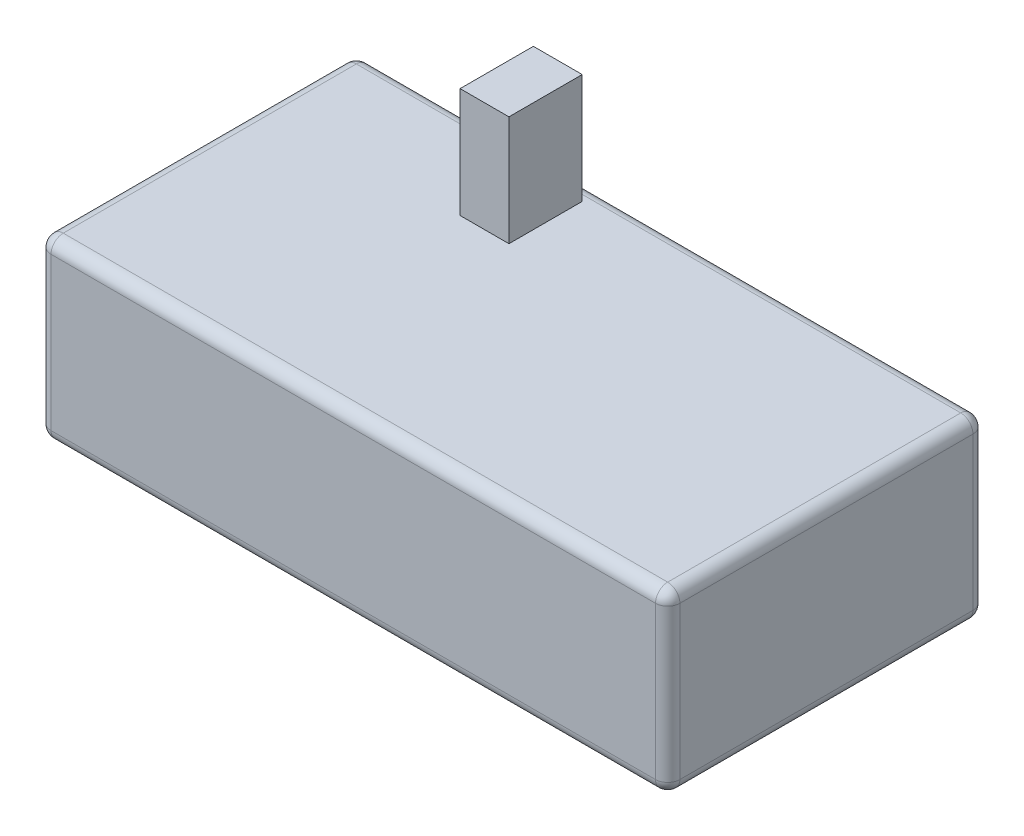
ISO-10303-21;
HEADER;
FILE_DESCRIPTION(('STEP AP214'),'2;1');
FILE_NAME('part.step','',(''),(''),'','','');
FILE_SCHEMA(('AUTOMOTIVE_DESIGN { 1 0 10303 214 1 1 1 1 }'));
ENDSEC;
DATA;
#1=APPLICATION_CONTEXT('core data for automotive mechanical design processes');
#2=APPLICATION_PROTOCOL_DEFINITION('international standard','automotive_design',2000,#1);
#3=PRODUCT_CONTEXT('',#1,'mechanical');
#4=PRODUCT('Part','Part','',(#3));
#5=PRODUCT_RELATED_PRODUCT_CATEGORY('part','',(#4));
#6=PRODUCT_DEFINITION_FORMATION('','',#4);
#7=PRODUCT_DEFINITION_CONTEXT('part definition',#1,'design');
#8=PRODUCT_DEFINITION('design','',#6,#7);
#9=PRODUCT_DEFINITION_SHAPE('','',#8);
#10=(LENGTH_UNIT() NAMED_UNIT(*) SI_UNIT(.MILLI.,.METRE.));
#11=(NAMED_UNIT(*) PLANE_ANGLE_UNIT() SI_UNIT($,.RADIAN.));
#12=(NAMED_UNIT(*) SI_UNIT($,.STERADIAN.) SOLID_ANGLE_UNIT());
#13=UNCERTAINTY_MEASURE_WITH_UNIT(LENGTH_MEASURE(1.E-05),#10,'distance_accuracy_value','');
#14=(GEOMETRIC_REPRESENTATION_CONTEXT(3) GLOBAL_UNCERTAINTY_ASSIGNED_CONTEXT((#13)) GLOBAL_UNIT_ASSIGNED_CONTEXT((#10,
#11,#12)) REPRESENTATION_CONTEXT('',''));
#15=CARTESIAN_POINT('',(0.,0.,0.));
#16=DIRECTION('',(0.,0.,1.));
#17=DIRECTION('',(1.,0.,0.));
#18=AXIS2_PLACEMENT_3D('',#15,#16,#17);
#19=CARTESIAN_POINT('',(-65.405,36.83,-33.02));
#20=DIRECTION('',(0.,0.,1.));
#21=DIRECTION('',(1.,0.,0.));
#22=AXIS2_PLACEMENT_3D('',#19,#20,#21);
#23=PLANE('',#22);
#24=DIRECTION('',(0.,-1.,0.));
#25=VECTOR('',#24,1.);
#26=CARTESIAN_POINT('',(62.865,36.83,-33.02));
#27=LINE('',#26,#25);
#28=CARTESIAN_POINT('',(62.865,34.29,-33.02));
#29=VERTEX_POINT('',#28);
#30=CARTESIAN_POINT('',(62.865,2.54,-33.02));
#31=VERTEX_POINT('',#30);
#32=EDGE_CURVE('E298',#29,#31,#27,.T.);
#33=ORIENTED_EDGE('',*,*,#32,.T.);
#34=DIRECTION('',(-1.,0.,0.));
#35=VECTOR('',#34,1.);
#36=CARTESIAN_POINT('',(-65.405,2.54,-33.02));
#37=LINE('',#36,#35);
#38=CARTESIAN_POINT('',(-62.865,2.54,-33.02));
#39=VERTEX_POINT('',#38);
#40=EDGE_CURVE('E302',#31,#39,#37,.T.);
#41=ORIENTED_EDGE('',*,*,#40,.T.);
#42=DIRECTION('',(0.,-1.,0.));
#43=VECTOR('',#42,1.);
#44=CARTESIAN_POINT('',(-62.865,36.83,-33.02));
#45=LINE('',#44,#43);
#46=CARTESIAN_POINT('',(-62.865,34.29,-33.02));
#47=VERTEX_POINT('',#46);
#48=EDGE_CURVE('E300',#39,#47,#45,.F.);
#49=ORIENTED_EDGE('',*,*,#48,.T.);
#50=DIRECTION('',(-1.,0.,0.));
#51=VECTOR('',#50,1.);
#52=CARTESIAN_POINT('',(65.405,34.29,-33.02));
#53=LINE('',#52,#51);
#54=EDGE_CURVE('E296',#47,#29,#53,.F.);
#55=ORIENTED_EDGE('',*,*,#54,.T.);
#56=EDGE_LOOP('',(#33,#41,#49,#55));
#57=FACE_BOUND('',#56,.T.);
#58=DIRECTION('',(0.,-1.,0.));
#59=VECTOR('',#58,1.);
#60=CARTESIAN_POINT('',(0.594999999999971,12.,-33.02));
#61=LINE('',#60,#59);
#62=CARTESIAN_POINT('',(0.594999999999971,12.,-33.02));
#63=VERTEX_POINT('',#62);
#64=CARTESIAN_POINT('',(0.594999999999971,7.936,-33.02));
#65=VERTEX_POINT('',#64);
#66=EDGE_CURVE('E233',#63,#65,#61,.T.);
#67=ORIENTED_EDGE('',*,*,#66,.F.);
#68=DIRECTION('',(1.,0.,0.));
#69=VECTOR('',#68,1.);
#70=CARTESIAN_POINT('',(0.594999999999971,12.,-33.02));
#71=LINE('',#70,#69);
#72=CARTESIAN_POINT('',(-12.405,12.,-33.02));
#73=VERTEX_POINT('',#72);
#74=EDGE_CURVE('E238',#73,#63,#71,.T.);
#75=ORIENTED_EDGE('',*,*,#74,.F.);
#76=DIRECTION('',(0.,1.,0.));
#77=VECTOR('',#76,1.);
#78=CARTESIAN_POINT('',(-12.405,12.,-33.02));
#79=LINE('',#78,#77);
#80=CARTESIAN_POINT('',(-12.405,7.936,-33.02));
#81=VERTEX_POINT('',#80);
#82=EDGE_CURVE('E250',#81,#73,#79,.T.);
#83=ORIENTED_EDGE('',*,*,#82,.F.);
#84=DIRECTION('',(-1.,0.,0.));
#85=VECTOR('',#84,1.);
#86=CARTESIAN_POINT('',(0.59499999999997,7.936,-33.02));
#87=LINE('',#86,#85);
#88=EDGE_CURVE('E247',#65,#81,#87,.T.);
#89=ORIENTED_EDGE('',*,*,#88,.F.);
#90=EDGE_LOOP('',(#67,#75,#83,#89));
#91=FACE_BOUND('',#90,.T.);
#92=ADVANCED_FACE('F33',(#57,#91),#23,.F.);
#93=CARTESIAN_POINT('',(0.,36.83,0.));
#94=DIRECTION('',(0.,1.,0.));
#95=DIRECTION('',(0.,0.,1.));
#96=AXIS2_PLACEMENT_3D('',#93,#94,#95);
#97=PLANE('',#96);
#98=DIRECTION('',(0.,0.,-1.));
#99=VECTOR('',#98,1.);
#100=CARTESIAN_POINT('',(62.865,36.83,-33.02));
#101=LINE('',#100,#99);
#102=CARTESIAN_POINT('',(62.865,36.83,30.48));
#103=VERTEX_POINT('',#102);
#104=CARTESIAN_POINT('',(62.865,36.83,-30.48));
#105=VERTEX_POINT('',#104);
#106=EDGE_CURVE('E42',#103,#105,#101,.T.);
#107=ORIENTED_EDGE('',*,*,#106,.T.);
#108=DIRECTION('',(-1.,0.,0.));
#109=VECTOR('',#108,1.);
#110=CARTESIAN_POINT('',(-65.405,36.83,-30.48));
#111=LINE('',#110,#109);
#112=CARTESIAN_POINT('',(-62.865,36.83,-30.48));
#113=VERTEX_POINT('',#112);
#114=EDGE_CURVE('E11',#105,#113,#111,.T.);
#115=ORIENTED_EDGE('',*,*,#114,.T.);
#116=DIRECTION('',(0.,0.,1.));
#117=VECTOR('',#116,1.);
#118=CARTESIAN_POINT('',(-62.865,36.83,33.02));
#119=LINE('',#118,#117);
#120=CARTESIAN_POINT('',(-62.865,36.83,30.48));
#121=VERTEX_POINT('',#120);
#122=EDGE_CURVE('E341',#113,#121,#119,.T.);
#123=ORIENTED_EDGE('',*,*,#122,.T.);
#124=DIRECTION('',(1.,0.,0.));
#125=VECTOR('',#124,1.);
#126=CARTESIAN_POINT('',(65.405,36.83,30.48));
#127=LINE('',#126,#125);
#128=EDGE_CURVE('E343',#121,#103,#127,.T.);
#129=ORIENTED_EDGE('',*,*,#128,.T.);
#130=EDGE_LOOP('',(#107,#115,#123,#129));
#131=FACE_BOUND('',#130,.T.);
#132=DIRECTION('',(-1.,0.,0.));
#133=VECTOR('',#132,1.);
#134=CARTESIAN_POINT('',(-14.605,36.83,-29.21));
#135=LINE('',#134,#133);
#136=CARTESIAN_POINT('',(-14.605,36.83,-29.21));
#137=VERTEX_POINT('',#136);
#138=CARTESIAN_POINT('',(-24.765,36.83,-29.21));
#139=VERTEX_POINT('',#138);
#140=EDGE_CURVE('E280',#137,#139,#135,.T.);
#141=ORIENTED_EDGE('',*,*,#140,.F.);
#142=DIRECTION('',(0.,0.,-1.));
#143=VECTOR('',#142,1.);
#144=CARTESIAN_POINT('',(-14.605,36.83,-13.97));
#145=LINE('',#144,#143);
#146=CARTESIAN_POINT('',(-14.605,36.83,-13.97));
#147=VERTEX_POINT('',#146);
#148=EDGE_CURVE('E266',#147,#137,#145,.T.);
#149=ORIENTED_EDGE('',*,*,#148,.F.);
#150=DIRECTION('',(1.,0.,0.));
#151=VECTOR('',#150,1.);
#152=CARTESIAN_POINT('',(-14.605,36.83,-13.97));
#153=LINE('',#152,#151);
#154=CARTESIAN_POINT('',(-24.765,36.83,-13.97));
#155=VERTEX_POINT('',#154);
#156=EDGE_CURVE('E271',#155,#147,#153,.T.);
#157=ORIENTED_EDGE('',*,*,#156,.F.);
#158=DIRECTION('',(0.,0.,1.));
#159=VECTOR('',#158,1.);
#160=CARTESIAN_POINT('',(-24.765,36.83,-13.97));
#161=LINE('',#160,#159);
#162=EDGE_CURVE('E282',#139,#155,#161,.T.);
#163=ORIENTED_EDGE('',*,*,#162,.F.);
#164=EDGE_LOOP('',(#141,#149,#157,#163));
#165=FACE_BOUND('',#164,.T.);
#166=ADVANCED_FACE('F436',(#131,#165),#97,.T.);
#167=CARTESIAN_POINT('',(-65.405,36.83,-33.02));
#168=DIRECTION('',(1.,0.,0.));
#169=DIRECTION('',(0.,0.,-1.));
#170=AXIS2_PLACEMENT_3D('',#167,#168,#169);
#171=PLANE('',#170);
#172=DIRECTION('',(0.,0.,1.));
#173=VECTOR('',#172,1.);
#174=CARTESIAN_POINT('',(-65.405,34.29,-33.02));
#175=LINE('',#174,#173);
#176=CARTESIAN_POINT('',(-65.405,34.29,30.48));
#177=VERTEX_POINT('',#176);
#178=CARTESIAN_POINT('',(-65.405,34.29,-30.48));
#179=VERTEX_POINT('',#178);
#180=EDGE_CURVE('E314',#177,#179,#175,.F.);
#181=ORIENTED_EDGE('',*,*,#180,.T.);
#182=DIRECTION('',(0.,-1.,0.));
#183=VECTOR('',#182,1.);
#184=CARTESIAN_POINT('',(-65.405,36.83,-30.48));
#185=LINE('',#184,#183);
#186=CARTESIAN_POINT('',(-65.405,2.54,-30.48));
#187=VERTEX_POINT('',#186);
#188=EDGE_CURVE('E320',#179,#187,#185,.T.);
#189=ORIENTED_EDGE('',*,*,#188,.T.);
#190=DIRECTION('',(0.,0.,1.));
#191=VECTOR('',#190,1.);
#192=CARTESIAN_POINT('',(-65.405,2.54,-33.02));
#193=LINE('',#192,#191);
#194=CARTESIAN_POINT('',(-65.405,2.54,30.48));
#195=VERTEX_POINT('',#194);
#196=EDGE_CURVE('E318',#187,#195,#193,.T.);
#197=ORIENTED_EDGE('',*,*,#196,.T.);
#198=DIRECTION('',(0.,-1.,0.));
#199=VECTOR('',#198,1.);
#200=CARTESIAN_POINT('',(-65.405,36.83,30.48));
#201=LINE('',#200,#199);
#202=EDGE_CURVE('E316',#195,#177,#201,.F.);
#203=ORIENTED_EDGE('',*,*,#202,.T.);
#204=EDGE_LOOP('',(#181,#189,#197,#203));
#205=FACE_BOUND('',#204,.T.);
#206=ADVANCED_FACE('F498',(#205),#171,.F.);
#207=CARTESIAN_POINT('',(-65.405,36.83,33.02));
#208=DIRECTION('',(0.,0.,-1.));
#209=DIRECTION('',(-1.,0.,0.));
#210=AXIS2_PLACEMENT_3D('',#207,#208,#209);
#211=PLANE('',#210);
#212=DIRECTION('',(1.,0.,0.));
#213=VECTOR('',#212,1.);
#214=CARTESIAN_POINT('',(-65.405,34.29,33.02));
#215=LINE('',#214,#213);
#216=CARTESIAN_POINT('',(62.865,34.29,33.02));
#217=VERTEX_POINT('',#216);
#218=CARTESIAN_POINT('',(-62.865,34.29,33.02));
#219=VERTEX_POINT('',#218);
#220=EDGE_CURVE('E323',#217,#219,#215,.F.);
#221=ORIENTED_EDGE('',*,*,#220,.T.);
#222=DIRECTION('',(0.,-1.,0.));
#223=VECTOR('',#222,1.);
#224=CARTESIAN_POINT('',(-62.865,36.83,33.02));
#225=LINE('',#224,#223);
#226=CARTESIAN_POINT('',(-62.865,2.54,33.02));
#227=VERTEX_POINT('',#226);
#228=EDGE_CURVE('E329',#219,#227,#225,.T.);
#229=ORIENTED_EDGE('',*,*,#228,.T.);
#230=DIRECTION('',(1.,0.,0.));
#231=VECTOR('',#230,1.);
#232=CARTESIAN_POINT('',(-65.405,2.54,33.02));
#233=LINE('',#232,#231);
#234=CARTESIAN_POINT('',(62.865,2.54,33.02));
#235=VERTEX_POINT('',#234);
#236=EDGE_CURVE('E327',#227,#235,#233,.T.);
#237=ORIENTED_EDGE('',*,*,#236,.T.);
#238=DIRECTION('',(0.,-1.,0.));
#239=VECTOR('',#238,1.);
#240=CARTESIAN_POINT('',(62.865,36.83,33.02));
#241=LINE('',#240,#239);
#242=EDGE_CURVE('E325',#235,#217,#241,.F.);
#243=ORIENTED_EDGE('',*,*,#242,.T.);
#244=EDGE_LOOP('',(#221,#229,#237,#243));
#245=FACE_BOUND('',#244,.T.);
#246=ADVANCED_FACE('F459',(#245),#211,.F.);
#247=CARTESIAN_POINT('',(65.405,36.83,-33.02));
#248=DIRECTION('',(-1.,0.,0.));
#249=DIRECTION('',(0.,0.,1.));
#250=AXIS2_PLACEMENT_3D('',#247,#248,#249);
#251=PLANE('',#250);
#252=DIRECTION('',(0.,-1.,0.));
#253=VECTOR('',#252,1.);
#254=CARTESIAN_POINT('',(65.405,36.83,30.48));
#255=LINE('',#254,#253);
#256=CARTESIAN_POINT('',(65.405,34.29,30.48));
#257=VERTEX_POINT('',#256);
#258=CARTESIAN_POINT('',(65.405,2.54,30.48));
#259=VERTEX_POINT('',#258);
#260=EDGE_CURVE('E336',#257,#259,#255,.T.);
#261=ORIENTED_EDGE('',*,*,#260,.T.);
#262=DIRECTION('',(0.,0.,-1.));
#263=VECTOR('',#262,1.);
#264=CARTESIAN_POINT('',(65.405,2.54,-33.02));
#265=LINE('',#264,#263);
#266=CARTESIAN_POINT('',(65.405,2.54,-30.48));
#267=VERTEX_POINT('',#266);
#268=EDGE_CURVE('E339',#259,#267,#265,.T.);
#269=ORIENTED_EDGE('',*,*,#268,.T.);
#270=DIRECTION('',(0.,-1.,0.));
#271=VECTOR('',#270,1.);
#272=CARTESIAN_POINT('',(65.405,36.83,-30.48));
#273=LINE('',#272,#271);
#274=CARTESIAN_POINT('',(65.405,34.29,-30.48));
#275=VERTEX_POINT('',#274);
#276=EDGE_CURVE('E334',#267,#275,#273,.F.);
#277=ORIENTED_EDGE('',*,*,#276,.T.);
#278=DIRECTION('',(0.,0.,-1.));
#279=VECTOR('',#278,1.);
#280=CARTESIAN_POINT('',(65.405,34.29,33.02));
#281=LINE('',#280,#279);
#282=EDGE_CURVE('E332',#275,#257,#281,.F.);
#283=ORIENTED_EDGE('',*,*,#282,.T.);
#284=EDGE_LOOP('',(#261,#269,#277,#283));
#285=FACE_BOUND('',#284,.T.);
#286=ADVANCED_FACE('F428',(#285),#251,.F.);
#287=CARTESIAN_POINT('',(0.,0.,0.));
#288=DIRECTION('',(0.,1.,0.));
#289=DIRECTION('',(0.,0.,1.));
#290=AXIS2_PLACEMENT_3D('',#287,#288,#289);
#291=PLANE('',#290);
#292=DIRECTION('',(0.,0.,1.));
#293=VECTOR('',#292,1.);
#294=CARTESIAN_POINT('',(-62.865,0.,0.));
#295=LINE('',#294,#293);
#296=CARTESIAN_POINT('',(-62.865,0.,30.48));
#297=VERTEX_POINT('',#296);
#298=CARTESIAN_POINT('',(-62.865,0.,-30.48));
#299=VERTEX_POINT('',#298);
#300=EDGE_CURVE('E309',#297,#299,#295,.F.);
#301=ORIENTED_EDGE('',*,*,#300,.T.);
#302=DIRECTION('',(-1.,0.,0.));
#303=VECTOR('',#302,1.);
#304=CARTESIAN_POINT('',(0.,0.,-30.48));
#305=LINE('',#304,#303);
#306=CARTESIAN_POINT('',(62.865,0.,-30.48));
#307=VERTEX_POINT('',#306);
#308=EDGE_CURVE('E311',#299,#307,#305,.F.);
#309=ORIENTED_EDGE('',*,*,#308,.T.);
#310=DIRECTION('',(0.,0.,-1.));
#311=VECTOR('',#310,1.);
#312=CARTESIAN_POINT('',(62.865,0.,0.));
#313=LINE('',#312,#311);
#314=CARTESIAN_POINT('',(62.865,0.,30.48));
#315=VERTEX_POINT('',#314);
#316=EDGE_CURVE('E305',#307,#315,#313,.F.);
#317=ORIENTED_EDGE('',*,*,#316,.T.);
#318=DIRECTION('',(1.,0.,0.));
#319=VECTOR('',#318,1.);
#320=CARTESIAN_POINT('',(0.,0.,30.48));
#321=LINE('',#320,#319);
#322=EDGE_CURVE('E307',#315,#297,#321,.F.);
#323=ORIENTED_EDGE('',*,*,#322,.T.);
#324=EDGE_LOOP('',(#301,#309,#317,#323));
#325=FACE_BOUND('',#324,.T.);
#326=ADVANCED_FACE('F503',(#325),#291,.F.);
#327=CARTESIAN_POINT('',(0.,34.29,30.48));
#328=DIRECTION('',(-1.,0.,0.));
#329=DIRECTION('',(0.,0.,1.));
#330=AXIS2_PLACEMENT_3D('',#327,#328,#329);
#331=CYLINDRICAL_SURFACE('',#330,2.54);
#332=CARTESIAN_POINT('',(62.865,34.29,30.48));
#333=DIRECTION('',(1.,0.,0.));
#334=DIRECTION('',(0.,0.,-1.));
#335=AXIS2_PLACEMENT_3D('',#332,#333,#334);
#336=CIRCLE('',#335,2.54);
#337=EDGE_CURVE('E37',#103,#217,#336,.T.);
#338=ORIENTED_EDGE('',*,*,#337,.F.);
#339=ORIENTED_EDGE('',*,*,#128,.F.);
#340=CARTESIAN_POINT('',(-62.865,34.29,30.48));
#341=DIRECTION('',(-1.,0.,0.));
#342=DIRECTION('',(0.,-1.,0.));
#343=AXIS2_PLACEMENT_3D('',#340,#341,#342);
#344=CIRCLE('',#343,2.54);
#345=EDGE_CURVE('E405',#219,#121,#344,.T.);
#346=ORIENTED_EDGE('',*,*,#345,.F.);
#347=ORIENTED_EDGE('',*,*,#220,.F.);
#348=EDGE_LOOP('',(#338,#339,#346,#347));
#349=FACE_BOUND('',#348,.T.);
#350=ADVANCED_FACE('F35',(#349),#331,.T.);
#351=CARTESIAN_POINT('',(62.865,34.29,30.48));
#352=DIRECTION('',(0.,0.,1.));
#353=DIRECTION('',(1.,0.,0.));
#354=AXIS2_PLACEMENT_3D('',#351,#352,#353);
#355=SPHERICAL_SURFACE('',#354,2.54);
#356=CARTESIAN_POINT('',(62.865,34.29,30.48));
#357=DIRECTION('',(0.,0.,1.));
#358=DIRECTION('',(1.,0.,0.));
#359=AXIS2_PLACEMENT_3D('',#356,#357,#358);
#360=CIRCLE('',#359,2.54);
#361=EDGE_CURVE('E400',#103,#257,#360,.F.);
#362=ORIENTED_EDGE('',*,*,#361,.F.);
#363=ORIENTED_EDGE('',*,*,#337,.T.);
#364=CARTESIAN_POINT('',(62.865,34.29,30.48));
#365=DIRECTION('',(0.,1.,0.));
#366=DIRECTION('',(0.,0.,1.));
#367=AXIS2_PLACEMENT_3D('',#364,#365,#366);
#368=CIRCLE('',#367,2.54);
#369=EDGE_CURVE('E403',#257,#217,#368,.F.);
#370=ORIENTED_EDGE('',*,*,#369,.F.);
#371=EDGE_LOOP('',(#362,#363,#370));
#372=FACE_BOUND('',#371,.T.);
#373=ADVANCED_FACE('F416',(#372),#355,.T.);
#374=CARTESIAN_POINT('',(-62.865,34.29,30.48));
#375=DIRECTION('',(0.,0.,1.));
#376=DIRECTION('',(1.,0.,0.));
#377=AXIS2_PLACEMENT_3D('',#374,#375,#376);
#378=SPHERICAL_SURFACE('',#377,2.54);
#379=CARTESIAN_POINT('',(-62.865,34.29,30.48));
#380=DIRECTION('',(0.,1.,0.));
#381=DIRECTION('',(0.,0.,1.));
#382=AXIS2_PLACEMENT_3D('',#379,#380,#381);
#383=CIRCLE('',#382,2.54);
#384=EDGE_CURVE('E394',#219,#177,#383,.F.);
#385=ORIENTED_EDGE('',*,*,#384,.F.);
#386=ORIENTED_EDGE('',*,*,#345,.T.);
#387=CARTESIAN_POINT('',(-62.865,34.29,30.48));
#388=DIRECTION('',(0.,0.,1.));
#389=DIRECTION('',(1.,0.,0.));
#390=AXIS2_PLACEMENT_3D('',#387,#388,#389);
#391=CIRCLE('',#390,2.54);
#392=EDGE_CURVE('E397',#177,#121,#391,.F.);
#393=ORIENTED_EDGE('',*,*,#392,.F.);
#394=EDGE_LOOP('',(#385,#386,#393));
#395=FACE_BOUND('',#394,.T.);
#396=ADVANCED_FACE('F452',(#395),#378,.T.);
#397=CARTESIAN_POINT('',(62.865,36.83,30.48));
#398=DIRECTION('',(0.,-1.,0.));
#399=DIRECTION('',(0.,0.,-1.));
#400=AXIS2_PLACEMENT_3D('',#397,#398,#399);
#401=CYLINDRICAL_SURFACE('',#400,2.54);
#402=ORIENTED_EDGE('',*,*,#369,.T.);
#403=ORIENTED_EDGE('',*,*,#242,.F.);
#404=CARTESIAN_POINT('',(62.865,2.54,30.48));
#405=DIRECTION('',(0.,-1.,0.));
#406=DIRECTION('',(0.,0.,-1.));
#407=AXIS2_PLACEMENT_3D('',#404,#405,#406);
#408=CIRCLE('',#407,2.54);
#409=EDGE_CURVE('E388',#259,#235,#408,.T.);
#410=ORIENTED_EDGE('',*,*,#409,.F.);
#411=ORIENTED_EDGE('',*,*,#260,.F.);
#412=EDGE_LOOP('',(#402,#403,#410,#411));
#413=FACE_BOUND('',#412,.T.);
#414=ADVANCED_FACE('F424',(#413),#401,.T.);
#415=CARTESIAN_POINT('',(62.865,34.29,0.));
#416=DIRECTION('',(0.,0.,1.));
#417=DIRECTION('',(1.,0.,0.));
#418=AXIS2_PLACEMENT_3D('',#415,#416,#417);
#419=CYLINDRICAL_SURFACE('',#418,2.54);
#420=ORIENTED_EDGE('',*,*,#361,.T.);
#421=ORIENTED_EDGE('',*,*,#282,.F.);
#422=CARTESIAN_POINT('',(62.865,34.29,-30.48));
#423=DIRECTION('',(0.,0.,-1.));
#424=DIRECTION('',(-1.,0.,0.));
#425=AXIS2_PLACEMENT_3D('',#422,#423,#424);
#426=CIRCLE('',#425,2.54);
#427=EDGE_CURVE('E385',#105,#275,#426,.T.);
#428=ORIENTED_EDGE('',*,*,#427,.F.);
#429=ORIENTED_EDGE('',*,*,#106,.F.);
#430=EDGE_LOOP('',(#420,#421,#428,#429));
#431=FACE_BOUND('',#430,.T.);
#432=ADVANCED_FACE('F433',(#431),#419,.T.);
#433=CARTESIAN_POINT('',(0.,34.29,-30.48));
#434=DIRECTION('',(1.,0.,0.));
#435=DIRECTION('',(0.,0.,-1.));
#436=AXIS2_PLACEMENT_3D('',#433,#434,#435);
#437=CYLINDRICAL_SURFACE('',#436,2.54);
#438=CARTESIAN_POINT('',(-62.865,34.29,-30.48));
#439=DIRECTION('',(-1.,0.,0.));
#440=DIRECTION('',(0.,0.,1.));
#441=AXIS2_PLACEMENT_3D('',#438,#439,#440);
#442=CIRCLE('',#441,2.54);
#443=EDGE_CURVE('E379',#113,#47,#442,.T.);
#444=ORIENTED_EDGE('',*,*,#443,.F.);
#445=ORIENTED_EDGE('',*,*,#114,.F.);
#446=CARTESIAN_POINT('',(62.865,34.29,-30.48));
#447=DIRECTION('',(1.,0.,0.));
#448=DIRECTION('',(0.,1.,0.));
#449=AXIS2_PLACEMENT_3D('',#446,#447,#448);
#450=CIRCLE('',#449,2.54);
#451=EDGE_CURVE('E382',#29,#105,#450,.T.);
#452=ORIENTED_EDGE('',*,*,#451,.F.);
#453=ORIENTED_EDGE('',*,*,#54,.F.);
#454=EDGE_LOOP('',(#444,#445,#452,#453));
#455=FACE_BOUND('',#454,.T.);
#456=ADVANCED_FACE('F441',(#455),#437,.T.);
#457=CARTESIAN_POINT('',(-62.865,34.29,0.));
#458=DIRECTION('',(0.,0.,-1.));
#459=DIRECTION('',(-1.,0.,0.));
#460=AXIS2_PLACEMENT_3D('',#457,#458,#459);
#461=CYLINDRICAL_SURFACE('',#460,2.54);
#462=ORIENTED_EDGE('',*,*,#392,.T.);
#463=ORIENTED_EDGE('',*,*,#122,.F.);
#464=CARTESIAN_POINT('',(-62.865,34.29,-30.48));
#465=DIRECTION('',(0.,0.,-1.));
#466=DIRECTION('',(-1.,0.,0.));
#467=AXIS2_PLACEMENT_3D('',#464,#465,#466);
#468=CIRCLE('',#467,2.54);
#469=EDGE_CURVE('E377',#179,#113,#468,.T.);
#470=ORIENTED_EDGE('',*,*,#469,.F.);
#471=ORIENTED_EDGE('',*,*,#180,.F.);
#472=EDGE_LOOP('',(#462,#463,#470,#471));
#473=FACE_BOUND('',#472,.T.);
#474=ADVANCED_FACE('F449',(#473),#461,.T.);
#475=CARTESIAN_POINT('',(-62.865,36.83,30.48));
#476=DIRECTION('',(0.,-1.,0.));
#477=DIRECTION('',(0.,0.,-1.));
#478=AXIS2_PLACEMENT_3D('',#475,#476,#477);
#479=CYLINDRICAL_SURFACE('',#478,2.54);
#480=ORIENTED_EDGE('',*,*,#384,.T.);
#481=ORIENTED_EDGE('',*,*,#202,.F.);
#482=CARTESIAN_POINT('',(-62.865,2.54,30.48));
#483=DIRECTION('',(0.,-1.,0.));
#484=DIRECTION('',(0.,0.,-1.));
#485=AXIS2_PLACEMENT_3D('',#482,#483,#484);
#486=CIRCLE('',#485,2.54);
#487=EDGE_CURVE('E374',#227,#195,#486,.T.);
#488=ORIENTED_EDGE('',*,*,#487,.F.);
#489=ORIENTED_EDGE('',*,*,#228,.F.);
#490=EDGE_LOOP('',(#480,#481,#488,#489));
#491=FACE_BOUND('',#490,.T.);
#492=ADVANCED_FACE('F456',(#491),#479,.T.);
#493=CARTESIAN_POINT('',(-65.405,2.54,30.48));
#494=DIRECTION('',(1.,0.,0.));
#495=DIRECTION('',(0.,0.,-1.));
#496=AXIS2_PLACEMENT_3D('',#493,#494,#495);
#497=CYLINDRICAL_SURFACE('',#496,2.54);
#498=CARTESIAN_POINT('',(62.865,2.54,30.48));
#499=DIRECTION('',(1.,0.,0.));
#500=DIRECTION('',(0.,0.,-1.));
#501=AXIS2_PLACEMENT_3D('',#498,#499,#500);
#502=CIRCLE('',#501,2.54);
#503=EDGE_CURVE('E391',#235,#315,#502,.T.);
#504=ORIENTED_EDGE('',*,*,#503,.F.);
#505=ORIENTED_EDGE('',*,*,#236,.F.);
#506=CARTESIAN_POINT('',(-62.865,2.54,30.48));
#507=DIRECTION('',(-1.,0.,0.));
#508=DIRECTION('',(0.,0.,1.));
#509=AXIS2_PLACEMENT_3D('',#506,#507,#508);
#510=CIRCLE('',#509,2.54);
#511=EDGE_CURVE('E372',#297,#227,#510,.T.);
#512=ORIENTED_EDGE('',*,*,#511,.F.);
#513=ORIENTED_EDGE('',*,*,#322,.F.);
#514=EDGE_LOOP('',(#504,#505,#512,#513));
#515=FACE_BOUND('',#514,.T.);
#516=ADVANCED_FACE('F462',(#515),#497,.T.);
#517=CARTESIAN_POINT('',(62.865,2.54,30.48));
#518=DIRECTION('',(0.,0.,1.));
#519=DIRECTION('',(1.,0.,0.));
#520=AXIS2_PLACEMENT_3D('',#517,#518,#519);
#521=SPHERICAL_SURFACE('',#520,2.54);
#522=ORIENTED_EDGE('',*,*,#409,.T.);
#523=ORIENTED_EDGE('',*,*,#503,.T.);
#524=CARTESIAN_POINT('',(62.865,2.54,30.48));
#525=DIRECTION('',(0.,0.,1.));
#526=DIRECTION('',(1.,0.,0.));
#527=AXIS2_PLACEMENT_3D('',#524,#525,#526);
#528=CIRCLE('',#527,2.54);
#529=EDGE_CURVE('E369',#259,#315,#528,.F.);
#530=ORIENTED_EDGE('',*,*,#529,.F.);
#531=EDGE_LOOP('',(#522,#523,#530));
#532=FACE_BOUND('',#531,.T.);
#533=ADVANCED_FACE('F467',(#532),#521,.T.);
#534=CARTESIAN_POINT('',(62.865,34.29,-30.48));
#535=DIRECTION('',(0.,0.,1.));
#536=DIRECTION('',(1.,0.,0.));
#537=AXIS2_PLACEMENT_3D('',#534,#535,#536);
#538=SPHERICAL_SURFACE('',#537,2.54);
#539=ORIENTED_EDGE('',*,*,#451,.T.);
#540=ORIENTED_EDGE('',*,*,#427,.T.);
#541=CARTESIAN_POINT('',(62.865,34.29,-30.48));
#542=DIRECTION('',(0.,1.,0.));
#543=DIRECTION('',(0.,0.,1.));
#544=AXIS2_PLACEMENT_3D('',#541,#542,#543);
#545=CIRCLE('',#544,2.54);
#546=EDGE_CURVE('E366',#29,#275,#545,.F.);
#547=ORIENTED_EDGE('',*,*,#546,.F.);
#548=EDGE_LOOP('',(#539,#540,#547));
#549=FACE_BOUND('',#548,.T.);
#550=ADVANCED_FACE('F481',(#549),#538,.T.);
#551=CARTESIAN_POINT('',(-62.865,34.29,-30.48));
#552=DIRECTION('',(0.,0.,1.));
#553=DIRECTION('',(1.,0.,0.));
#554=AXIS2_PLACEMENT_3D('',#551,#552,#553);
#555=SPHERICAL_SURFACE('',#554,2.54);
#556=ORIENTED_EDGE('',*,*,#469,.T.);
#557=ORIENTED_EDGE('',*,*,#443,.T.);
#558=CARTESIAN_POINT('',(-62.865,34.29,-30.48));
#559=DIRECTION('',(0.,1.,0.));
#560=DIRECTION('',(0.,0.,1.));
#561=AXIS2_PLACEMENT_3D('',#558,#559,#560);
#562=CIRCLE('',#561,2.54);
#563=EDGE_CURVE('E363',#179,#47,#562,.F.);
#564=ORIENTED_EDGE('',*,*,#563,.F.);
#565=EDGE_LOOP('',(#556,#557,#564));
#566=FACE_BOUND('',#565,.T.);
#567=ADVANCED_FACE('F483',(#566),#555,.T.);
#568=CARTESIAN_POINT('',(-62.865,2.54,30.48));
#569=DIRECTION('',(0.,0.,1.));
#570=DIRECTION('',(1.,0.,0.));
#571=AXIS2_PLACEMENT_3D('',#568,#569,#570);
#572=SPHERICAL_SURFACE('',#571,2.54);
#573=ORIENTED_EDGE('',*,*,#511,.T.);
#574=ORIENTED_EDGE('',*,*,#487,.T.);
#575=CARTESIAN_POINT('',(-62.865,2.54,30.48));
#576=DIRECTION('',(0.,0.,1.));
#577=DIRECTION('',(1.,0.,0.));
#578=AXIS2_PLACEMENT_3D('',#575,#576,#577);
#579=CIRCLE('',#578,2.54);
#580=EDGE_CURVE('E360',#297,#195,#579,.F.);
#581=ORIENTED_EDGE('',*,*,#580,.F.);
#582=EDGE_LOOP('',(#573,#574,#581));
#583=FACE_BOUND('',#582,.T.);
#584=ADVANCED_FACE('F489',(#583),#572,.T.);
#585=CARTESIAN_POINT('',(62.865,2.54,-33.02));
#586=DIRECTION('',(0.,0.,-1.));
#587=DIRECTION('',(-1.,0.,0.));
#588=AXIS2_PLACEMENT_3D('',#585,#586,#587);
#589=CYLINDRICAL_SURFACE('',#588,2.54);
#590=ORIENTED_EDGE('',*,*,#529,.T.);
#591=ORIENTED_EDGE('',*,*,#316,.F.);
#592=CARTESIAN_POINT('',(62.865,2.54,-30.48));
#593=DIRECTION('',(0.,0.,-1.));
#594=DIRECTION('',(-1.,0.,0.));
#595=AXIS2_PLACEMENT_3D('',#592,#593,#594);
#596=CIRCLE('',#595,2.54);
#597=EDGE_CURVE('E357',#267,#307,#596,.T.);
#598=ORIENTED_EDGE('',*,*,#597,.F.);
#599=ORIENTED_EDGE('',*,*,#268,.F.);
#600=EDGE_LOOP('',(#590,#591,#598,#599));
#601=FACE_BOUND('',#600,.T.);
#602=ADVANCED_FACE('F470',(#601),#589,.T.);
#603=CARTESIAN_POINT('',(62.865,36.83,-30.48));
#604=DIRECTION('',(0.,-1.,0.));
#605=DIRECTION('',(0.,0.,-1.));
#606=AXIS2_PLACEMENT_3D('',#603,#604,#605);
#607=CYLINDRICAL_SURFACE('',#606,2.54);
#608=ORIENTED_EDGE('',*,*,#546,.T.);
#609=ORIENTED_EDGE('',*,*,#276,.F.);
#610=CARTESIAN_POINT('',(62.865,2.54,-30.48));
#611=DIRECTION('',(0.,-1.,0.));
#612=DIRECTION('',(0.,0.,-1.));
#613=AXIS2_PLACEMENT_3D('',#610,#611,#612);
#614=CIRCLE('',#613,2.54);
#615=EDGE_CURVE('E354',#31,#267,#614,.T.);
#616=ORIENTED_EDGE('',*,*,#615,.F.);
#617=ORIENTED_EDGE('',*,*,#32,.F.);
#618=EDGE_LOOP('',(#608,#609,#616,#617));
#619=FACE_BOUND('',#618,.T.);
#620=ADVANCED_FACE('F479',(#619),#607,.T.);
#621=CARTESIAN_POINT('',(-62.865,36.83,-30.48));
#622=DIRECTION('',(0.,-1.,0.));
#623=DIRECTION('',(0.,0.,-1.));
#624=AXIS2_PLACEMENT_3D('',#621,#622,#623);
#625=CYLINDRICAL_SURFACE('',#624,2.54);
#626=ORIENTED_EDGE('',*,*,#563,.T.);
#627=ORIENTED_EDGE('',*,*,#48,.F.);
#628=CARTESIAN_POINT('',(-62.865,2.54,-30.48));
#629=DIRECTION('',(0.,-1.,0.));
#630=DIRECTION('',(0.,0.,-1.));
#631=AXIS2_PLACEMENT_3D('',#628,#629,#630);
#632=CIRCLE('',#631,2.54);
#633=EDGE_CURVE('E351',#187,#39,#632,.T.);
#634=ORIENTED_EDGE('',*,*,#633,.F.);
#635=ORIENTED_EDGE('',*,*,#188,.F.);
#636=EDGE_LOOP('',(#626,#627,#634,#635));
#637=FACE_BOUND('',#636,.T.);
#638=ADVANCED_FACE('F525',(#637),#625,.T.);
#639=CARTESIAN_POINT('',(-62.865,2.54,-33.02));
#640=DIRECTION('',(0.,0.,1.));
#641=DIRECTION('',(1.,0.,0.));
#642=AXIS2_PLACEMENT_3D('',#639,#640,#641);
#643=CYLINDRICAL_SURFACE('',#642,2.54);
#644=ORIENTED_EDGE('',*,*,#580,.T.);
#645=ORIENTED_EDGE('',*,*,#196,.F.);
#646=CARTESIAN_POINT('',(-62.865,2.54,-30.48));
#647=DIRECTION('',(0.,0.,-1.));
#648=DIRECTION('',(-1.,0.,0.));
#649=AXIS2_PLACEMENT_3D('',#646,#647,#648);
#650=CIRCLE('',#649,2.54);
#651=EDGE_CURVE('E349',#299,#187,#650,.T.);
#652=ORIENTED_EDGE('',*,*,#651,.F.);
#653=ORIENTED_EDGE('',*,*,#300,.F.);
#654=EDGE_LOOP('',(#644,#645,#652,#653));
#655=FACE_BOUND('',#654,.T.);
#656=ADVANCED_FACE('F522',(#655),#643,.T.);
#657=CARTESIAN_POINT('',(62.865,2.54,-30.48));
#658=DIRECTION('',(0.,0.,1.));
#659=DIRECTION('',(1.,0.,0.));
#660=AXIS2_PLACEMENT_3D('',#657,#658,#659);
#661=SPHERICAL_SURFACE('',#660,2.54);
#662=ORIENTED_EDGE('',*,*,#615,.T.);
#663=ORIENTED_EDGE('',*,*,#597,.T.);
#664=CARTESIAN_POINT('',(62.865,2.54,-30.48));
#665=DIRECTION('',(1.,0.,0.));
#666=DIRECTION('',(0.,0.,-1.));
#667=AXIS2_PLACEMENT_3D('',#664,#665,#666);
#668=CIRCLE('',#667,2.54);
#669=EDGE_CURVE('E347',#31,#307,#668,.F.);
#670=ORIENTED_EDGE('',*,*,#669,.F.);
#671=EDGE_LOOP('',(#662,#663,#670));
#672=FACE_BOUND('',#671,.T.);
#673=ADVANCED_FACE('F475',(#672),#661,.T.);
#674=CARTESIAN_POINT('',(-62.865,2.54,-30.48));
#675=DIRECTION('',(0.,0.,1.));
#676=DIRECTION('',(1.,0.,0.));
#677=AXIS2_PLACEMENT_3D('',#674,#675,#676);
#678=SPHERICAL_SURFACE('',#677,2.54);
#679=ORIENTED_EDGE('',*,*,#651,.T.);
#680=ORIENTED_EDGE('',*,*,#633,.T.);
#681=CARTESIAN_POINT('',(-62.865,2.54,-30.48));
#682=DIRECTION('',(-1.,0.,0.));
#683=DIRECTION('',(0.,0.,1.));
#684=AXIS2_PLACEMENT_3D('',#681,#682,#683);
#685=CIRCLE('',#684,2.54);
#686=EDGE_CURVE('E295',#299,#39,#685,.F.);
#687=ORIENTED_EDGE('',*,*,#686,.F.);
#688=EDGE_LOOP('',(#679,#680,#687));
#689=FACE_BOUND('',#688,.T.);
#690=ADVANCED_FACE('F515',(#689),#678,.T.);
#691=CARTESIAN_POINT('',(-65.405,2.54,-30.48));
#692=DIRECTION('',(-1.,0.,0.));
#693=DIRECTION('',(0.,0.,1.));
#694=AXIS2_PLACEMENT_3D('',#691,#692,#693);
#695=CYLINDRICAL_SURFACE('',#694,2.54);
#696=ORIENTED_EDGE('',*,*,#669,.T.);
#697=ORIENTED_EDGE('',*,*,#308,.F.);
#698=ORIENTED_EDGE('',*,*,#686,.T.);
#699=ORIENTED_EDGE('',*,*,#40,.F.);
#700=EDGE_LOOP('',(#696,#697,#698,#699));
#701=FACE_BOUND('',#700,.T.);
#702=ADVANCED_FACE('F511',(#701),#695,.T.);
#703=CARTESIAN_POINT('',(-14.605,59.69,-13.97));
#704=DIRECTION('',(-1.,0.,0.));
#705=DIRECTION('',(0.,0.,1.));
#706=AXIS2_PLACEMENT_3D('',#703,#704,#705);
#707=PLANE('',#706);
#708=ORIENTED_EDGE('',*,*,#148,.T.);
#709=DIRECTION('',(0.,-1.,0.));
#710=VECTOR('',#709,1.);
#711=CARTESIAN_POINT('',(-14.605,59.69,-29.21));
#712=LINE('',#711,#710);
#713=CARTESIAN_POINT('',(-14.605,59.69,-29.21));
#714=VERTEX_POINT('',#713);
#715=EDGE_CURVE('E293',#714,#137,#712,.T.);
#716=ORIENTED_EDGE('',*,*,#715,.F.);
#717=DIRECTION('',(0.,0.,-1.));
#718=VECTOR('',#717,1.);
#719=CARTESIAN_POINT('',(-14.605,59.69,-13.97));
#720=LINE('',#719,#718);
#721=CARTESIAN_POINT('',(-14.605,59.69,-13.97));
#722=VERTEX_POINT('',#721);
#723=EDGE_CURVE('E267',#722,#714,#720,.T.);
#724=ORIENTED_EDGE('',*,*,#723,.F.);
#725=DIRECTION('',(0.,-1.,0.));
#726=VECTOR('',#725,1.);
#727=CARTESIAN_POINT('',(-14.605,59.69,-13.97));
#728=LINE('',#727,#726);
#729=EDGE_CURVE('E277',#722,#147,#728,.T.);
#730=ORIENTED_EDGE('',*,*,#729,.T.);
#731=EDGE_LOOP('',(#708,#716,#724,#730));
#732=FACE_BOUND('',#731,.T.);
#733=ADVANCED_FACE('F514',(#732),#707,.F.);
#734=CARTESIAN_POINT('',(-14.605,59.69,-29.21));
#735=DIRECTION('',(0.,0.,1.));
#736=DIRECTION('',(1.,0.,0.));
#737=AXIS2_PLACEMENT_3D('',#734,#735,#736);
#738=PLANE('',#737);
#739=ORIENTED_EDGE('',*,*,#140,.T.);
#740=DIRECTION('',(0.,-1.,0.));
#741=VECTOR('',#740,1.);
#742=CARTESIAN_POINT('',(-24.765,59.69,-29.21));
#743=LINE('',#742,#741);
#744=CARTESIAN_POINT('',(-24.765,59.69,-29.21));
#745=VERTEX_POINT('',#744);
#746=EDGE_CURVE('E290',#745,#139,#743,.T.);
#747=ORIENTED_EDGE('',*,*,#746,.F.);
#748=DIRECTION('',(-1.,0.,0.));
#749=VECTOR('',#748,1.);
#750=CARTESIAN_POINT('',(-14.605,59.69,-29.21));
#751=LINE('',#750,#749);
#752=EDGE_CURVE('E270',#714,#745,#751,.T.);
#753=ORIENTED_EDGE('',*,*,#752,.F.);
#754=ORIENTED_EDGE('',*,*,#715,.T.);
#755=EDGE_LOOP('',(#739,#747,#753,#754));
#756=FACE_BOUND('',#755,.T.);
#757=ADVANCED_FACE('F649',(#756),#738,.F.);
#758=CARTESIAN_POINT('',(-24.765,59.69,-13.97));
#759=DIRECTION('',(1.,0.,0.));
#760=DIRECTION('',(0.,0.,-1.));
#761=AXIS2_PLACEMENT_3D('',#758,#759,#760);
#762=PLANE('',#761);
#763=ORIENTED_EDGE('',*,*,#162,.T.);
#764=DIRECTION('',(0.,-1.,0.));
#765=VECTOR('',#764,1.);
#766=CARTESIAN_POINT('',(-24.765,59.69,-13.97));
#767=LINE('',#766,#765);
#768=CARTESIAN_POINT('',(-24.765,59.69,-13.97));
#769=VERTEX_POINT('',#768);
#770=EDGE_CURVE('E288',#769,#155,#767,.T.);
#771=ORIENTED_EDGE('',*,*,#770,.F.);
#772=DIRECTION('',(0.,0.,1.));
#773=VECTOR('',#772,1.);
#774=CARTESIAN_POINT('',(-24.765,59.69,-13.97));
#775=LINE('',#774,#773);
#776=EDGE_CURVE('E273',#745,#769,#775,.T.);
#777=ORIENTED_EDGE('',*,*,#776,.F.);
#778=ORIENTED_EDGE('',*,*,#746,.T.);
#779=EDGE_LOOP('',(#763,#771,#777,#778));
#780=FACE_BOUND('',#779,.T.);
#781=ADVANCED_FACE('F659',(#780),#762,.F.);
#782=CARTESIAN_POINT('',(-14.605,59.69,-13.97));
#783=DIRECTION('',(0.,0.,-1.));
#784=DIRECTION('',(-1.,0.,0.));
#785=AXIS2_PLACEMENT_3D('',#782,#783,#784);
#786=PLANE('',#785);
#787=ORIENTED_EDGE('',*,*,#156,.T.);
#788=ORIENTED_EDGE('',*,*,#729,.F.);
#789=DIRECTION('',(1.,0.,0.));
#790=VECTOR('',#789,1.);
#791=CARTESIAN_POINT('',(-14.605,59.69,-13.97));
#792=LINE('',#791,#790);
#793=EDGE_CURVE('E275',#769,#722,#792,.T.);
#794=ORIENTED_EDGE('',*,*,#793,.F.);
#795=ORIENTED_EDGE('',*,*,#770,.T.);
#796=EDGE_LOOP('',(#787,#788,#794,#795));
#797=FACE_BOUND('',#796,.T.);
#798=ADVANCED_FACE('F669',(#797),#786,.F.);
#799=CARTESIAN_POINT('',(0.,59.69,0.));
#800=DIRECTION('',(0.,1.,0.));
#801=DIRECTION('',(0.,0.,1.));
#802=AXIS2_PLACEMENT_3D('',#799,#800,#801);
#803=PLANE('',#802);
#804=ORIENTED_EDGE('',*,*,#723,.T.);
#805=ORIENTED_EDGE('',*,*,#752,.T.);
#806=ORIENTED_EDGE('',*,*,#776,.T.);
#807=ORIENTED_EDGE('',*,*,#793,.T.);
#808=EDGE_LOOP('',(#804,#805,#806,#807));
#809=FACE_BOUND('',#808,.T.);
#810=ADVANCED_FACE('F679',(#809),#803,.T.);
#811=CARTESIAN_POINT('',(0.594999999999971,12.,-42.545));
#812=DIRECTION('',(-1.,0.,0.));
#813=DIRECTION('',(0.,-1.,0.));
#814=AXIS2_PLACEMENT_3D('',#811,#812,#813);
#815=PLANE('',#814);
#816=ORIENTED_EDGE('',*,*,#66,.T.);
#817=DIRECTION('',(0.,0.,1.));
#818=VECTOR('',#817,1.);
#819=CARTESIAN_POINT('',(0.59499999999997,7.936,-42.545));
#820=LINE('',#819,#818);
#821=CARTESIAN_POINT('',(0.59499999999997,7.936,-42.545));
#822=VERTEX_POINT('',#821);
#823=EDGE_CURVE('E263',#822,#65,#820,.T.);
#824=ORIENTED_EDGE('',*,*,#823,.F.);
#825=DIRECTION('',(0.,-1.,0.));
#826=VECTOR('',#825,1.);
#827=CARTESIAN_POINT('',(0.594999999999971,12.,-42.545));
#828=LINE('',#827,#826);
#829=CARTESIAN_POINT('',(0.594999999999971,12.,-42.545));
#830=VERTEX_POINT('',#829);
#831=EDGE_CURVE('E234',#830,#822,#828,.T.);
#832=ORIENTED_EDGE('',*,*,#831,.F.);
#833=DIRECTION('',(0.,0.,1.));
#834=VECTOR('',#833,1.);
#835=CARTESIAN_POINT('',(0.594999999999971,12.,-42.545));
#836=LINE('',#835,#834);
#837=EDGE_CURVE('E244',#830,#63,#836,.T.);
#838=ORIENTED_EDGE('',*,*,#837,.T.);
#839=EDGE_LOOP('',(#816,#824,#832,#838));
#840=FACE_BOUND('',#839,.T.);
#841=ADVANCED_FACE('F688',(#840),#815,.F.);
#842=CARTESIAN_POINT('',(0.59499999999997,7.936,-42.545));
#843=DIRECTION('',(0.,1.,0.));
#844=DIRECTION('',(0.,0.,1.));
#845=AXIS2_PLACEMENT_3D('',#842,#843,#844);
#846=PLANE('',#845);
#847=DIRECTION('',(1.,0.,0.));
#848=VECTOR('',#847,1.);
#849=CARTESIAN_POINT('',(0.59499999999997,7.936,-35.433));
#850=LINE('',#849,#848);
#851=CARTESIAN_POINT('',(-8.34100000000003,7.936,-35.433));
#852=VERTEX_POINT('',#851);
#853=CARTESIAN_POINT('',(-3.46900000000003,7.936,-35.433));
#854=VERTEX_POINT('',#853);
#855=EDGE_CURVE('E227',#852,#854,#850,.T.);
#856=ORIENTED_EDGE('',*,*,#855,.T.);
#857=DIRECTION('',(0.,0.,-1.));
#858=VECTOR('',#857,1.);
#859=CARTESIAN_POINT('',(-3.46900000000003,7.936,-42.545));
#860=LINE('',#859,#858);
#861=CARTESIAN_POINT('',(-3.46900000000003,7.936,-40.513));
#862=VERTEX_POINT('',#861);
#863=EDGE_CURVE('E230',#854,#862,#860,.T.);
#864=ORIENTED_EDGE('',*,*,#863,.T.);
#865=DIRECTION('',(-1.,0.,0.));
#866=VECTOR('',#865,1.);
#867=CARTESIAN_POINT('',(0.59499999999997,7.936,-40.513));
#868=LINE('',#867,#866);
#869=CARTESIAN_POINT('',(-8.34100000000003,7.936,-40.513));
#870=VERTEX_POINT('',#869);
#871=EDGE_CURVE('E222',#862,#870,#868,.T.);
#872=ORIENTED_EDGE('',*,*,#871,.T.);
#873=DIRECTION('',(0.,0.,1.));
#874=VECTOR('',#873,1.);
#875=CARTESIAN_POINT('',(-8.34100000000003,7.936,-42.545));
#876=LINE('',#875,#874);
#877=EDGE_CURVE('E202',#870,#852,#876,.T.);
#878=ORIENTED_EDGE('',*,*,#877,.T.);
#879=EDGE_LOOP('',(#856,#864,#872,#878));
#880=FACE_BOUND('',#879,.T.);
#881=ORIENTED_EDGE('',*,*,#88,.T.);
#882=DIRECTION('',(0.,0.,1.));
#883=VECTOR('',#882,1.);
#884=CARTESIAN_POINT('',(-12.405,7.936,-42.545));
#885=LINE('',#884,#883);
#886=CARTESIAN_POINT('',(-12.405,7.936,-42.545));
#887=VERTEX_POINT('',#886);
#888=EDGE_CURVE('E260',#887,#81,#885,.T.);
#889=ORIENTED_EDGE('',*,*,#888,.F.);
#890=DIRECTION('',(-1.,0.,0.));
#891=VECTOR('',#890,1.);
#892=CARTESIAN_POINT('',(0.59499999999997,7.936,-42.545));
#893=LINE('',#892,#891);
#894=EDGE_CURVE('E237',#822,#887,#893,.T.);
#895=ORIENTED_EDGE('',*,*,#894,.F.);
#896=ORIENTED_EDGE('',*,*,#823,.T.);
#897=EDGE_LOOP('',(#881,#889,#895,#896));
#898=FACE_BOUND('',#897,.T.);
#899=ADVANCED_FACE('F703',(#880,#898),#846,.F.);
#900=CARTESIAN_POINT('',(-12.405,12.,-42.545));
#901=DIRECTION('',(1.,0.,0.));
#902=DIRECTION('',(0.,0.,-1.));
#903=AXIS2_PLACEMENT_3D('',#900,#901,#902);
#904=PLANE('',#903);
#905=ORIENTED_EDGE('',*,*,#82,.T.);
#906=DIRECTION('',(0.,0.,1.));
#907=VECTOR('',#906,1.);
#908=CARTESIAN_POINT('',(-12.405,12.,-42.545));
#909=LINE('',#908,#907);
#910=CARTESIAN_POINT('',(-12.405,12.,-42.545));
#911=VERTEX_POINT('',#910);
#912=EDGE_CURVE('E257',#911,#73,#909,.T.);
#913=ORIENTED_EDGE('',*,*,#912,.F.);
#914=DIRECTION('',(0.,1.,0.));
#915=VECTOR('',#914,1.);
#916=CARTESIAN_POINT('',(-12.405,12.,-42.545));
#917=LINE('',#916,#915);
#918=EDGE_CURVE('E240',#887,#911,#917,.T.);
#919=ORIENTED_EDGE('',*,*,#918,.F.);
#920=ORIENTED_EDGE('',*,*,#888,.T.);
#921=EDGE_LOOP('',(#905,#913,#919,#920));
#922=FACE_BOUND('',#921,.T.);
#923=ADVANCED_FACE('F711',(#922),#904,.F.);
#924=CARTESIAN_POINT('',(0.594999999999971,12.,-42.545));
#925=DIRECTION('',(0.,-1.,0.));
#926=DIRECTION('',(1.,0.,0.));
#927=AXIS2_PLACEMENT_3D('',#924,#925,#926);
#928=PLANE('',#927);
#929=DIRECTION('',(-1.,0.,0.));
#930=VECTOR('',#929,1.);
#931=CARTESIAN_POINT('',(-3.46900000000003,12.,-40.513));
#932=LINE('',#931,#930);
#933=CARTESIAN_POINT('',(-3.46900000000003,12.,-40.513));
#934=VERTEX_POINT('',#933);
#935=CARTESIAN_POINT('',(-8.34100000000003,12.,-40.513));
#936=VERTEX_POINT('',#935);
#937=EDGE_CURVE('E208',#934,#936,#932,.T.);
#938=ORIENTED_EDGE('',*,*,#937,.F.);
#939=DIRECTION('',(0.,0.,-1.));
#940=VECTOR('',#939,1.);
#941=CARTESIAN_POINT('',(-3.46900000000003,12.,-35.433));
#942=LINE('',#941,#940);
#943=CARTESIAN_POINT('',(-3.46900000000003,12.,-35.433));
#944=VERTEX_POINT('',#943);
#945=EDGE_CURVE('E58',#944,#934,#942,.T.);
#946=ORIENTED_EDGE('',*,*,#945,.F.);
#947=DIRECTION('',(1.,0.,0.));
#948=VECTOR('',#947,1.);
#949=CARTESIAN_POINT('',(-3.46900000000003,12.,-35.433));
#950=LINE('',#949,#948);
#951=CARTESIAN_POINT('',(-8.34100000000003,12.,-35.433));
#952=VERTEX_POINT('',#951);
#953=EDGE_CURVE('E215',#952,#944,#950,.T.);
#954=ORIENTED_EDGE('',*,*,#953,.F.);
#955=DIRECTION('',(0.,0.,1.));
#956=VECTOR('',#955,1.);
#957=CARTESIAN_POINT('',(-8.34100000000003,12.,-40.513));
#958=LINE('',#957,#956);
#959=EDGE_CURVE('E199',#936,#952,#958,.T.);
#960=ORIENTED_EDGE('',*,*,#959,.F.);
#961=EDGE_LOOP('',(#938,#946,#954,#960));
#962=FACE_BOUND('',#961,.T.);
#963=ORIENTED_EDGE('',*,*,#74,.T.);
#964=ORIENTED_EDGE('',*,*,#837,.F.);
#965=DIRECTION('',(1.,0.,0.));
#966=VECTOR('',#965,1.);
#967=CARTESIAN_POINT('',(0.594999999999971,12.,-42.545));
#968=LINE('',#967,#966);
#969=EDGE_CURVE('E242',#911,#830,#968,.T.);
#970=ORIENTED_EDGE('',*,*,#969,.F.);
#971=ORIENTED_EDGE('',*,*,#912,.T.);
#972=EDGE_LOOP('',(#963,#964,#970,#971));
#973=FACE_BOUND('',#972,.T.);
#974=ADVANCED_FACE('F212',(#962,#973),#928,.F.);
#975=CARTESIAN_POINT('',(0.,0.,-42.545));
#976=DIRECTION('',(0.,0.,-1.));
#977=DIRECTION('',(-1.,0.,0.));
#978=AXIS2_PLACEMENT_3D('',#975,#976,#977);
#979=PLANE('',#978);
#980=ORIENTED_EDGE('',*,*,#831,.T.);
#981=ORIENTED_EDGE('',*,*,#894,.T.);
#982=ORIENTED_EDGE('',*,*,#918,.T.);
#983=ORIENTED_EDGE('',*,*,#969,.T.);
#984=EDGE_LOOP('',(#980,#981,#982,#983));
#985=FACE_BOUND('',#984,.T.);
#986=ADVANCED_FACE('F723',(#985),#979,.T.);
#987=CARTESIAN_POINT('',(-3.46900000000003,0.,-35.433));
#988=DIRECTION('',(1.,0.,0.));
#989=DIRECTION('',(0.,0.,-1.));
#990=AXIS2_PLACEMENT_3D('',#987,#988,#989);
#991=PLANE('',#990);
#992=DIRECTION('',(0.,1.,0.));
#993=VECTOR('',#992,1.);
#994=CARTESIAN_POINT('',(-3.46900000000003,0.,-35.433));
#995=LINE('',#994,#993);
#996=EDGE_CURVE('E220',#854,#944,#995,.T.);
#997=ORIENTED_EDGE('',*,*,#996,.T.);
#998=ORIENTED_EDGE('',*,*,#945,.T.);
#999=DIRECTION('',(0.,1.,0.));
#1000=VECTOR('',#999,1.);
#1001=CARTESIAN_POINT('',(-3.46900000000003,0.,-40.513));
#1002=LINE('',#1001,#1000);
#1003=EDGE_CURVE('E205',#862,#934,#1002,.T.);
#1004=ORIENTED_EDGE('',*,*,#1003,.F.);
#1005=ORIENTED_EDGE('',*,*,#863,.F.);
#1006=EDGE_LOOP('',(#997,#998,#1004,#1005));
#1007=FACE_BOUND('',#1006,.T.);
#1008=ADVANCED_FACE('F728',(#1007),#991,.F.);
#1009=CARTESIAN_POINT('',(-3.46900000000003,0.,-35.433));
#1010=DIRECTION('',(0.,0.,1.));
#1011=DIRECTION('',(1.,0.,0.));
#1012=AXIS2_PLACEMENT_3D('',#1009,#1010,#1011);
#1013=PLANE('',#1012);
#1014=DIRECTION('',(0.,1.,0.));
#1015=VECTOR('',#1014,1.);
#1016=CARTESIAN_POINT('',(-8.34100000000003,0.,-35.433));
#1017=LINE('',#1016,#1015);
#1018=EDGE_CURVE('E204',#852,#952,#1017,.T.);
#1019=ORIENTED_EDGE('',*,*,#1018,.T.);
#1020=ORIENTED_EDGE('',*,*,#953,.T.);
#1021=ORIENTED_EDGE('',*,*,#996,.F.);
#1022=ORIENTED_EDGE('',*,*,#855,.F.);
#1023=EDGE_LOOP('',(#1019,#1020,#1021,#1022));
#1024=FACE_BOUND('',#1023,.T.);
#1025=ADVANCED_FACE('F751',(#1024),#1013,.F.);
#1026=CARTESIAN_POINT('',(-8.34100000000003,0.,-40.513));
#1027=DIRECTION('',(-1.,0.,0.));
#1028=DIRECTION('',(0.,0.,1.));
#1029=AXIS2_PLACEMENT_3D('',#1026,#1027,#1028);
#1030=PLANE('',#1029);
#1031=DIRECTION('',(0.,1.,0.));
#1032=VECTOR('',#1031,1.);
#1033=CARTESIAN_POINT('',(-8.34100000000003,0.,-40.513));
#1034=LINE('',#1033,#1032);
#1035=EDGE_CURVE('E50',#870,#936,#1034,.T.);
#1036=ORIENTED_EDGE('',*,*,#1035,.T.);
#1037=ORIENTED_EDGE('',*,*,#959,.T.);
#1038=ORIENTED_EDGE('',*,*,#1018,.F.);
#1039=ORIENTED_EDGE('',*,*,#877,.F.);
#1040=EDGE_LOOP('',(#1036,#1037,#1038,#1039));
#1041=FACE_BOUND('',#1040,.T.);
#1042=ADVANCED_FACE('F196',(#1041),#1030,.F.);
#1043=CARTESIAN_POINT('',(-3.46900000000003,0.,-40.513));
#1044=DIRECTION('',(0.,0.,-1.));
#1045=DIRECTION('',(-1.,0.,0.));
#1046=AXIS2_PLACEMENT_3D('',#1043,#1044,#1045);
#1047=PLANE('',#1046);
#1048=ORIENTED_EDGE('',*,*,#1003,.T.);
#1049=ORIENTED_EDGE('',*,*,#937,.T.);
#1050=ORIENTED_EDGE('',*,*,#1035,.F.);
#1051=ORIENTED_EDGE('',*,*,#871,.F.);
#1052=EDGE_LOOP('',(#1048,#1049,#1050,#1051));
#1053=FACE_BOUND('',#1052,.T.);
#1054=ADVANCED_FACE('F209',(#1053),#1047,.F.);
#1055=CLOSED_SHELL('',(#92,#166,#206,#246,#286,#326,#350,#373,#396,#414,#432,#456,#474,#492,
#516,#533,#550,#567,#584,#602,#620,#638,#656,#673,#690,#702,#733,#757,#781,#798,#810,#841,#899,
#923,#974,#986,#1008,#1025,#1042,#1054));
#1056=MANIFOLD_SOLID_BREP('B2',#1055);
#1057=ADVANCED_BREP_SHAPE_REPRESENTATION('',(#18,#1056),#14);
#1058=SHAPE_DEFINITION_REPRESENTATION(#9,#1057);
ENDSEC;
END-ISO-10303-21;
